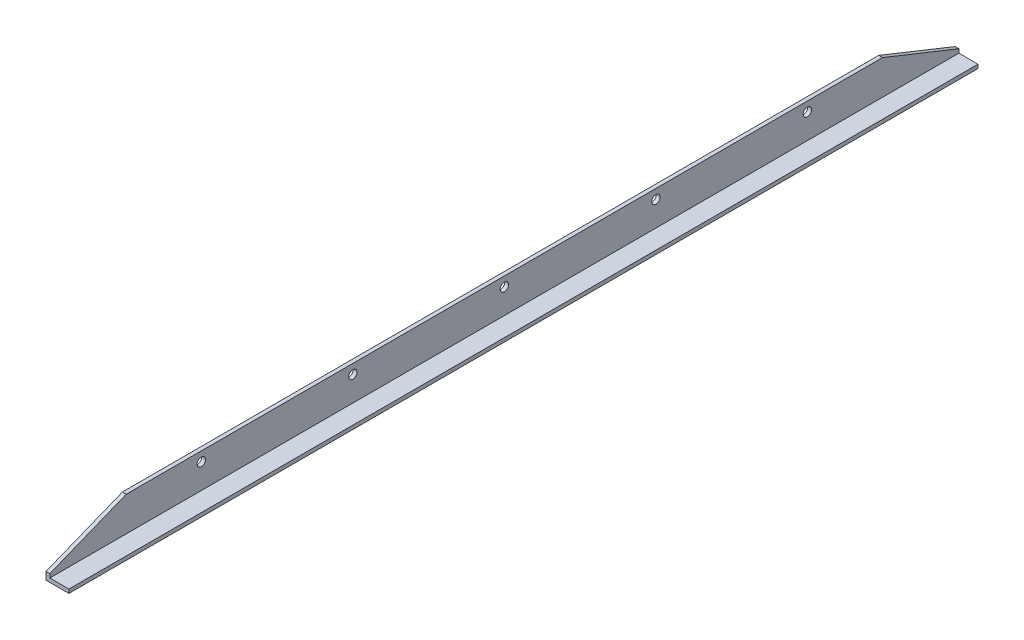
ISO-10303-21;
HEADER;
FILE_DESCRIPTION(('STEP AP214'),'2;1');
FILE_NAME('part.step','',(''),(''),'','','');
FILE_SCHEMA(('AUTOMOTIVE_DESIGN { 1 0 10303 214 1 1 1 1 }'));
ENDSEC;
DATA;
#1=APPLICATION_CONTEXT('core data for automotive mechanical design processes');
#2=APPLICATION_PROTOCOL_DEFINITION('international standard','automotive_design',2000,#1);
#3=PRODUCT_CONTEXT('',#1,'mechanical');
#4=PRODUCT('Part','Part','',(#3));
#5=PRODUCT_RELATED_PRODUCT_CATEGORY('part','',(#4));
#6=PRODUCT_DEFINITION_FORMATION('','',#4);
#7=PRODUCT_DEFINITION_CONTEXT('part definition',#1,'design');
#8=PRODUCT_DEFINITION('design','',#6,#7);
#9=PRODUCT_DEFINITION_SHAPE('','',#8);
#10=(LENGTH_UNIT() NAMED_UNIT(*) SI_UNIT(.MILLI.,.METRE.));
#11=(NAMED_UNIT(*) PLANE_ANGLE_UNIT() SI_UNIT($,.RADIAN.));
#12=(NAMED_UNIT(*) SI_UNIT($,.STERADIAN.) SOLID_ANGLE_UNIT());
#13=UNCERTAINTY_MEASURE_WITH_UNIT(LENGTH_MEASURE(1.E-05),#10,'distance_accuracy_value','');
#14=(GEOMETRIC_REPRESENTATION_CONTEXT(3) GLOBAL_UNCERTAINTY_ASSIGNED_CONTEXT((#13)) GLOBAL_UNIT_ASSIGNED_CONTEXT((#10,
#11,#12)) REPRESENTATION_CONTEXT('',''));
#15=CARTESIAN_POINT('',(0.,0.,0.));
#16=DIRECTION('',(0.,0.,1.));
#17=DIRECTION('',(1.,0.,0.));
#18=AXIS2_PLACEMENT_3D('',#15,#16,#17);
#19=CARTESIAN_POINT('',(0.,0.,1511.3));
#20=DIRECTION('',(0.,1.,0.));
#21=DIRECTION('',(0.,0.,1.));
#22=AXIS2_PLACEMENT_3D('',#19,#20,#21);
#23=PLANE('',#22);
#24=DIRECTION('',(1.,0.,0.));
#25=VECTOR('',#24,1.);
#26=CARTESIAN_POINT('',(0.,0.,0.));
#27=LINE('',#26,#25);
#28=CARTESIAN_POINT('',(0.,0.,0.));
#29=VERTEX_POINT('',#28);
#30=CARTESIAN_POINT('',(38.1,0.,0.));
#31=VERTEX_POINT('',#30);
#32=EDGE_CURVE('E164',#29,#31,#27,.T.);
#33=ORIENTED_EDGE('',*,*,#32,.T.);
#34=DIRECTION('',(0.,0.,-1.));
#35=VECTOR('',#34,1.);
#36=CARTESIAN_POINT('',(38.1,0.,1511.3));
#37=LINE('',#36,#35);
#38=CARTESIAN_POINT('',(38.1,0.,1511.3));
#39=VERTEX_POINT('',#38);
#40=EDGE_CURVE('E11',#39,#31,#37,.T.);
#41=ORIENTED_EDGE('',*,*,#40,.F.);
#42=DIRECTION('',(1.,0.,0.));
#43=VECTOR('',#42,1.);
#44=CARTESIAN_POINT('',(0.,0.,1511.3));
#45=LINE('',#44,#43);
#46=CARTESIAN_POINT('',(0.,0.,1511.3));
#47=VERTEX_POINT('',#46);
#48=EDGE_CURVE('E165',#47,#39,#45,.T.);
#49=ORIENTED_EDGE('',*,*,#48,.F.);
#50=DIRECTION('',(0.,0.,-1.));
#51=VECTOR('',#50,1.);
#52=CARTESIAN_POINT('',(0.,0.,1511.3));
#53=LINE('',#52,#51);
#54=EDGE_CURVE('E128',#47,#29,#53,.T.);
#55=ORIENTED_EDGE('',*,*,#54,.T.);
#56=EDGE_LOOP('',(#33,#41,#49,#55));
#57=FACE_BOUND('',#56,.T.);
#58=ADVANCED_FACE('F38',(#57),#23,.F.);
#59=CARTESIAN_POINT('',(38.1,6.35,1511.3));
#60=DIRECTION('',(1.,0.,0.));
#61=DIRECTION('',(0.,0.,-1.));
#62=AXIS2_PLACEMENT_3D('',#59,#60,#61);
#63=PLANE('',#62);
#64=DIRECTION('',(0.,-1.,0.));
#65=VECTOR('',#64,1.);
#66=CARTESIAN_POINT('',(38.1,6.35,0.));
#67=LINE('',#66,#65);
#68=CARTESIAN_POINT('',(38.1,6.35,0.));
#69=VERTEX_POINT('',#68);
#70=EDGE_CURVE('E180',#69,#31,#67,.T.);
#71=ORIENTED_EDGE('',*,*,#70,.F.);
#72=DIRECTION('',(0.,0.,-1.));
#73=VECTOR('',#72,1.);
#74=CARTESIAN_POINT('',(38.1,6.35,1511.3));
#75=LINE('',#74,#73);
#76=CARTESIAN_POINT('',(38.1,6.35,1511.3));
#77=VERTEX_POINT('',#76);
#78=EDGE_CURVE('E47',#77,#69,#75,.T.);
#79=ORIENTED_EDGE('',*,*,#78,.F.);
#80=DIRECTION('',(0.,-1.,0.));
#81=VECTOR('',#80,1.);
#82=CARTESIAN_POINT('',(38.1,6.35,1511.3));
#83=LINE('',#82,#81);
#84=EDGE_CURVE('E167',#77,#39,#83,.T.);
#85=ORIENTED_EDGE('',*,*,#84,.T.);
#86=ORIENTED_EDGE('',*,*,#40,.T.);
#87=EDGE_LOOP('',(#71,#79,#85,#86));
#88=FACE_BOUND('',#87,.T.);
#89=ADVANCED_FACE('F203',(#88),#63,.T.);
#90=CARTESIAN_POINT('',(0.,6.35,1511.3));
#91=DIRECTION('',(0.,1.,0.));
#92=DIRECTION('',(0.,0.,1.));
#93=AXIS2_PLACEMENT_3D('',#90,#91,#92);
#94=PLANE('',#93);
#95=DIRECTION('',(1.,0.,0.));
#96=VECTOR('',#95,1.);
#97=CARTESIAN_POINT('',(0.,6.35,0.));
#98=LINE('',#97,#96);
#99=CARTESIAN_POINT('',(6.35,6.35,0.));
#100=VERTEX_POINT('',#99);
#101=EDGE_CURVE('E183',#100,#69,#98,.T.);
#102=ORIENTED_EDGE('',*,*,#101,.F.);
#103=DIRECTION('',(0.,0.,-1.));
#104=VECTOR('',#103,1.);
#105=CARTESIAN_POINT('',(6.35,6.35,1511.3));
#106=LINE('',#105,#104);
#107=CARTESIAN_POINT('',(6.35,6.35,1511.3));
#108=VERTEX_POINT('',#107);
#109=EDGE_CURVE('E123',#108,#100,#106,.T.);
#110=ORIENTED_EDGE('',*,*,#109,.F.);
#111=DIRECTION('',(1.,0.,0.));
#112=VECTOR('',#111,1.);
#113=CARTESIAN_POINT('',(0.,6.35,1511.3));
#114=LINE('',#113,#112);
#115=EDGE_CURVE('E171',#108,#77,#114,.T.);
#116=ORIENTED_EDGE('',*,*,#115,.T.);
#117=ORIENTED_EDGE('',*,*,#78,.T.);
#118=EDGE_LOOP('',(#102,#110,#116,#117));
#119=FACE_BOUND('',#118,.T.);
#120=ADVANCED_FACE('F210',(#119),#94,.T.);
#121=CARTESIAN_POINT('',(6.35,63.5,1511.3));
#122=DIRECTION('',(1.,0.,0.));
#123=DIRECTION('',(0.,0.,-1.));
#124=AXIS2_PLACEMENT_3D('',#121,#122,#123);
#125=PLANE('',#124);
#126=DIRECTION('',(0.,-0.371390676354104,0.928476690885259));
#127=VECTOR('',#126,1.);
#128=CARTESIAN_POINT('',(6.34999999999999,12.7,1511.3));
#129=LINE('',#128,#127);
#130=CARTESIAN_POINT('',(6.34999999999999,63.5,1384.3));
#131=VERTEX_POINT('',#130);
#132=CARTESIAN_POINT('',(6.34999999999999,12.7,1511.3));
#133=VERTEX_POINT('',#132);
#134=EDGE_CURVE('E102',#131,#133,#129,.T.);
#135=ORIENTED_EDGE('',*,*,#134,.T.);
#136=DIRECTION('',(0.,1.,0.));
#137=VECTOR('',#136,1.);
#138=CARTESIAN_POINT('',(6.35,63.5,1511.3));
#139=LINE('',#138,#137);
#140=EDGE_CURVE('E174',#133,#108,#139,.F.);
#141=ORIENTED_EDGE('',*,*,#140,.T.);
#142=ORIENTED_EDGE('',*,*,#109,.T.);
#143=DIRECTION('',(0.,1.,0.));
#144=VECTOR('',#143,1.);
#145=CARTESIAN_POINT('',(6.35,63.5,0.));
#146=LINE('',#145,#144);
#147=CARTESIAN_POINT('',(6.35,12.7,0.));
#148=VERTEX_POINT('',#147);
#149=EDGE_CURVE('E186',#148,#100,#146,.F.);
#150=ORIENTED_EDGE('',*,*,#149,.F.);
#151=DIRECTION('',(0.,0.371390676354104,0.928476690885259));
#152=VECTOR('',#151,1.);
#153=CARTESIAN_POINT('',(6.34999999999999,63.5,127.));
#154=LINE('',#153,#152);
#155=CARTESIAN_POINT('',(6.34999999999999,63.5,127.));
#156=VERTEX_POINT('',#155);
#157=EDGE_CURVE('E63',#148,#156,#154,.T.);
#158=ORIENTED_EDGE('',*,*,#157,.T.);
#159=DIRECTION('',(0.,0.,-1.));
#160=VECTOR('',#159,1.);
#161=CARTESIAN_POINT('',(6.35,63.5,1511.3));
#162=LINE('',#161,#160);
#163=EDGE_CURVE('E116',#131,#156,#162,.T.);
#164=ORIENTED_EDGE('',*,*,#163,.F.);
#165=EDGE_LOOP('',(#135,#141,#142,#150,#158,#164));
#166=FACE_BOUND('',#165,.T.);
#167=CARTESIAN_POINT('',(6.35,47.6250000000001,1259.41666666667));
#168=DIRECTION('',(1.,0.,0.));
#169=DIRECTION('',(0.,0.,-1.));
#170=AXIS2_PLACEMENT_3D('',#167,#168,#169);
#171=CIRCLE('',#170,6.94563);
#172=CARTESIAN_POINT('',(6.35,47.6250000000001,1252.47103666667));
#173=VERTEX_POINT('',#172);
#174=EDGE_CURVE('E41',#173,#173,#171,.T.);
#175=ORIENTED_EDGE('',*,*,#174,.F.);
#176=EDGE_LOOP('',(#175));
#177=FACE_BOUND('',#176,.T.);
#178=CARTESIAN_POINT('',(6.35,47.6250000000001,1007.53333333333));
#179=DIRECTION('',(1.,0.,0.));
#180=DIRECTION('',(0.,0.,-1.));
#181=AXIS2_PLACEMENT_3D('',#178,#179,#180);
#182=CIRCLE('',#181,6.94563);
#183=CARTESIAN_POINT('',(6.35,47.6250000000001,1000.58770333333));
#184=VERTEX_POINT('',#183);
#185=EDGE_CURVE('E137',#184,#184,#182,.T.);
#186=ORIENTED_EDGE('',*,*,#185,.F.);
#187=EDGE_LOOP('',(#186));
#188=FACE_BOUND('',#187,.T.);
#189=CARTESIAN_POINT('',(6.35,47.6250000000001,755.65));
#190=DIRECTION('',(1.,0.,0.));
#191=DIRECTION('',(0.,0.,-1.));
#192=AXIS2_PLACEMENT_3D('',#189,#190,#191);
#193=CIRCLE('',#192,6.94563);
#194=CARTESIAN_POINT('',(6.35,47.6250000000001,748.70437));
#195=VERTEX_POINT('',#194);
#196=EDGE_CURVE('E144',#195,#195,#193,.T.);
#197=ORIENTED_EDGE('',*,*,#196,.F.);
#198=EDGE_LOOP('',(#197));
#199=FACE_BOUND('',#198,.T.);
#200=CARTESIAN_POINT('',(6.35,47.625,503.766666666667));
#201=DIRECTION('',(1.,0.,0.));
#202=DIRECTION('',(0.,0.,-1.));
#203=AXIS2_PLACEMENT_3D('',#200,#201,#202);
#204=CIRCLE('',#203,6.94563);
#205=CARTESIAN_POINT('',(6.35,47.625,496.821036666667));
#206=VERTEX_POINT('',#205);
#207=EDGE_CURVE('E133',#206,#206,#204,.T.);
#208=ORIENTED_EDGE('',*,*,#207,.F.);
#209=EDGE_LOOP('',(#208));
#210=FACE_BOUND('',#209,.T.);
#211=CARTESIAN_POINT('',(6.35,47.625,251.883333333333));
#212=DIRECTION('',(1.,0.,0.));
#213=DIRECTION('',(0.,0.,-1.));
#214=AXIS2_PLACEMENT_3D('',#211,#212,#213);
#215=CIRCLE('',#214,6.94563);
#216=CARTESIAN_POINT('',(6.35,47.625,244.937703333333));
#217=VERTEX_POINT('',#216);
#218=EDGE_CURVE('E161',#217,#217,#215,.T.);
#219=ORIENTED_EDGE('',*,*,#218,.F.);
#220=EDGE_LOOP('',(#219));
#221=FACE_BOUND('',#220,.T.);
#222=ADVANCED_FACE('F120',(#166,#177,#188,#199,#210,#221),#125,.T.);
#223=CARTESIAN_POINT('',(0.,63.5,1511.3));
#224=DIRECTION('',(0.,1.,0.));
#225=DIRECTION('',(0.,0.,1.));
#226=AXIS2_PLACEMENT_3D('',#223,#224,#225);
#227=PLANE('',#226);
#228=DIRECTION('',(-1.,0.,0.));
#229=VECTOR('',#228,1.);
#230=CARTESIAN_POINT('',(143.133186101216,63.5,1384.3));
#231=LINE('',#230,#229);
#232=CARTESIAN_POINT('',(0.,63.5,1384.3));
#233=VERTEX_POINT('',#232);
#234=EDGE_CURVE('E105',#131,#233,#231,.T.);
#235=ORIENTED_EDGE('',*,*,#234,.F.);
#236=ORIENTED_EDGE('',*,*,#163,.T.);
#237=DIRECTION('',(-1.,0.,0.));
#238=VECTOR('',#237,1.);
#239=CARTESIAN_POINT('',(143.133186101216,63.5,127.));
#240=LINE('',#239,#238);
#241=CARTESIAN_POINT('',(0.,63.5,127.));
#242=VERTEX_POINT('',#241);
#243=EDGE_CURVE('E214',#156,#242,#240,.T.);
#244=ORIENTED_EDGE('',*,*,#243,.T.);
#245=DIRECTION('',(0.,0.,-1.));
#246=VECTOR('',#245,1.);
#247=CARTESIAN_POINT('',(0.,63.5,1511.3));
#248=LINE('',#247,#246);
#249=EDGE_CURVE('E118',#233,#242,#248,.T.);
#250=ORIENTED_EDGE('',*,*,#249,.F.);
#251=EDGE_LOOP('',(#235,#236,#244,#250));
#252=FACE_BOUND('',#251,.T.);
#253=ADVANCED_FACE('F114',(#252),#227,.T.);
#254=CARTESIAN_POINT('',(0.,63.5,1511.3));
#255=DIRECTION('',(1.,0.,0.));
#256=DIRECTION('',(0.,0.,-1.));
#257=AXIS2_PLACEMENT_3D('',#254,#255,#256);
#258=PLANE('',#257);
#259=CARTESIAN_POINT('',(0.,47.6250000000001,1259.41666666667));
#260=DIRECTION('',(-1.,0.,0.));
#261=DIRECTION('',(0.,0.,1.));
#262=AXIS2_PLACEMENT_3D('',#259,#260,#261);
#263=CIRCLE('',#262,6.94563);
#264=CARTESIAN_POINT('',(0.,47.6250000000001,1266.36229666667));
#265=VERTEX_POINT('',#264);
#266=EDGE_CURVE('E151',#265,#265,#263,.T.);
#267=ORIENTED_EDGE('',*,*,#266,.F.);
#268=EDGE_LOOP('',(#267));
#269=FACE_BOUND('',#268,.T.);
#270=CARTESIAN_POINT('',(0.,47.6250000000001,1007.53333333333));
#271=DIRECTION('',(-1.,0.,0.));
#272=DIRECTION('',(0.,0.,1.));
#273=AXIS2_PLACEMENT_3D('',#270,#271,#272);
#274=CIRCLE('',#273,6.94563);
#275=CARTESIAN_POINT('',(0.,47.6250000000001,1014.47896333333));
#276=VERTEX_POINT('',#275);
#277=EDGE_CURVE('E140',#276,#276,#274,.T.);
#278=ORIENTED_EDGE('',*,*,#277,.F.);
#279=EDGE_LOOP('',(#278));
#280=FACE_BOUND('',#279,.T.);
#281=CARTESIAN_POINT('',(0.,47.6250000000001,755.65));
#282=DIRECTION('',(-1.,0.,0.));
#283=DIRECTION('',(0.,0.,1.));
#284=AXIS2_PLACEMENT_3D('',#281,#282,#283);
#285=CIRCLE('',#284,6.94563);
#286=CARTESIAN_POINT('',(0.,47.6250000000001,762.59563));
#287=VERTEX_POINT('',#286);
#288=EDGE_CURVE('E139',#287,#287,#285,.T.);
#289=ORIENTED_EDGE('',*,*,#288,.F.);
#290=EDGE_LOOP('',(#289));
#291=FACE_BOUND('',#290,.T.);
#292=CARTESIAN_POINT('',(0.,47.625,503.766666666667));
#293=DIRECTION('',(-1.,0.,0.));
#294=DIRECTION('',(0.,0.,1.));
#295=AXIS2_PLACEMENT_3D('',#292,#293,#294);
#296=CIRCLE('',#295,6.94563);
#297=CARTESIAN_POINT('',(0.,47.625,510.712296666667));
#298=VERTEX_POINT('',#297);
#299=EDGE_CURVE('E136',#298,#298,#296,.T.);
#300=ORIENTED_EDGE('',*,*,#299,.F.);
#301=EDGE_LOOP('',(#300));
#302=FACE_BOUND('',#301,.T.);
#303=CARTESIAN_POINT('',(0.,47.625,251.883333333333));
#304=DIRECTION('',(-1.,0.,0.));
#305=DIRECTION('',(0.,0.,1.));
#306=AXIS2_PLACEMENT_3D('',#303,#304,#305);
#307=CIRCLE('',#306,6.94563);
#308=CARTESIAN_POINT('',(0.,47.625,258.828963333333));
#309=VERTEX_POINT('',#308);
#310=EDGE_CURVE('E135',#309,#309,#307,.T.);
#311=ORIENTED_EDGE('',*,*,#310,.F.);
#312=EDGE_LOOP('',(#311));
#313=FACE_BOUND('',#312,.T.);
#314=DIRECTION('',(0.,-1.,0.));
#315=VECTOR('',#314,1.);
#316=CARTESIAN_POINT('',(0.,63.5,1511.3));
#317=LINE('',#316,#315);
#318=CARTESIAN_POINT('',(0.,12.7,1511.3));
#319=VERTEX_POINT('',#318);
#320=EDGE_CURVE('E176',#319,#47,#317,.T.);
#321=ORIENTED_EDGE('',*,*,#320,.F.);
#322=DIRECTION('',(0.,-0.371390676354104,0.928476690885259));
#323=VECTOR('',#322,1.);
#324=CARTESIAN_POINT('',(0.,12.7,1511.3));
#325=LINE('',#324,#323);
#326=EDGE_CURVE('E55',#233,#319,#325,.T.);
#327=ORIENTED_EDGE('',*,*,#326,.F.);
#328=ORIENTED_EDGE('',*,*,#249,.T.);
#329=DIRECTION('',(0.,0.371390676354104,0.928476690885259));
#330=VECTOR('',#329,1.);
#331=CARTESIAN_POINT('',(0.,63.5,127.));
#332=LINE('',#331,#330);
#333=CARTESIAN_POINT('',(0.,12.7,0.));
#334=VERTEX_POINT('',#333);
#335=EDGE_CURVE('E218',#334,#242,#332,.T.);
#336=ORIENTED_EDGE('',*,*,#335,.F.);
#337=DIRECTION('',(0.,-1.,0.));
#338=VECTOR('',#337,1.);
#339=CARTESIAN_POINT('',(0.,63.5,0.));
#340=LINE('',#339,#338);
#341=EDGE_CURVE('E168',#334,#29,#340,.T.);
#342=ORIENTED_EDGE('',*,*,#341,.T.);
#343=ORIENTED_EDGE('',*,*,#54,.F.);
#344=EDGE_LOOP('',(#321,#327,#328,#336,#342,#343));
#345=FACE_BOUND('',#344,.T.);
#346=ADVANCED_FACE('F212',(#269,#280,#291,#302,#313,#345),#258,.F.);
#347=CARTESIAN_POINT('',(0.,0.,1511.3));
#348=DIRECTION('',(0.,0.,-1.));
#349=DIRECTION('',(-1.,0.,0.));
#350=AXIS2_PLACEMENT_3D('',#347,#348,#349);
#351=PLANE('',#350);
#352=ORIENTED_EDGE('',*,*,#140,.F.);
#353=DIRECTION('',(-1.,0.,0.));
#354=VECTOR('',#353,1.);
#355=CARTESIAN_POINT('',(143.133186101216,12.7,1511.3));
#356=LINE('',#355,#354);
#357=EDGE_CURVE('E106',#133,#319,#356,.T.);
#358=ORIENTED_EDGE('',*,*,#357,.T.);
#359=ORIENTED_EDGE('',*,*,#320,.T.);
#360=ORIENTED_EDGE('',*,*,#48,.T.);
#361=ORIENTED_EDGE('',*,*,#84,.F.);
#362=ORIENTED_EDGE('',*,*,#115,.F.);
#363=EDGE_LOOP('',(#352,#358,#359,#360,#361,#362));
#364=FACE_BOUND('',#363,.T.);
#365=ADVANCED_FACE('F207',(#364),#351,.F.);
#366=CARTESIAN_POINT('',(0.,0.,0.));
#367=DIRECTION('',(0.,0.,-1.));
#368=DIRECTION('',(-1.,0.,0.));
#369=AXIS2_PLACEMENT_3D('',#366,#367,#368);
#370=PLANE('',#369);
#371=DIRECTION('',(-1.,0.,0.));
#372=VECTOR('',#371,1.);
#373=CARTESIAN_POINT('',(143.133186101216,12.7,0.));
#374=LINE('',#373,#372);
#375=EDGE_CURVE('E220',#148,#334,#374,.T.);
#376=ORIENTED_EDGE('',*,*,#375,.F.);
#377=ORIENTED_EDGE('',*,*,#149,.T.);
#378=ORIENTED_EDGE('',*,*,#101,.T.);
#379=ORIENTED_EDGE('',*,*,#70,.T.);
#380=ORIENTED_EDGE('',*,*,#32,.F.);
#381=ORIENTED_EDGE('',*,*,#341,.F.);
#382=EDGE_LOOP('',(#376,#377,#378,#379,#380,#381));
#383=FACE_BOUND('',#382,.T.);
#384=ADVANCED_FACE('F199',(#383),#370,.T.);
#385=CARTESIAN_POINT('',(0.,47.625,251.883333333333));
#386=DIRECTION('',(-1.,0.,0.));
#387=DIRECTION('',(0.,0.,1.));
#388=AXIS2_PLACEMENT_3D('',#385,#386,#387);
#389=CYLINDRICAL_SURFACE('',#388,6.94563);
#390=ORIENTED_EDGE('',*,*,#218,.T.);
#391=EDGE_LOOP('',(#390));
#392=FACE_BOUND('',#391,.T.);
#393=ORIENTED_EDGE('',*,*,#310,.T.);
#394=EDGE_LOOP('',(#393));
#395=FACE_BOUND('',#394,.T.);
#396=ADVANCED_FACE('F251',(#392,#395),#389,.F.);
#397=CARTESIAN_POINT('',(0.,47.625,503.766666666667));
#398=DIRECTION('',(-1.,0.,0.));
#399=DIRECTION('',(0.,0.,1.));
#400=AXIS2_PLACEMENT_3D('',#397,#398,#399);
#401=CYLINDRICAL_SURFACE('',#400,6.94563);
#402=ORIENTED_EDGE('',*,*,#207,.T.);
#403=EDGE_LOOP('',(#402));
#404=FACE_BOUND('',#403,.T.);
#405=ORIENTED_EDGE('',*,*,#299,.T.);
#406=EDGE_LOOP('',(#405));
#407=FACE_BOUND('',#406,.T.);
#408=ADVANCED_FACE('F256',(#404,#407),#401,.F.);
#409=CARTESIAN_POINT('',(0.,47.6250000000001,755.65));
#410=DIRECTION('',(-1.,0.,0.));
#411=DIRECTION('',(0.,0.,1.));
#412=AXIS2_PLACEMENT_3D('',#409,#410,#411);
#413=CYLINDRICAL_SURFACE('',#412,6.94563);
#414=ORIENTED_EDGE('',*,*,#196,.T.);
#415=EDGE_LOOP('',(#414));
#416=FACE_BOUND('',#415,.T.);
#417=ORIENTED_EDGE('',*,*,#288,.T.);
#418=EDGE_LOOP('',(#417));
#419=FACE_BOUND('',#418,.T.);
#420=ADVANCED_FACE('F260',(#416,#419),#413,.F.);
#421=CARTESIAN_POINT('',(0.,47.6250000000001,1007.53333333333));
#422=DIRECTION('',(-1.,0.,0.));
#423=DIRECTION('',(0.,0.,1.));
#424=AXIS2_PLACEMENT_3D('',#421,#422,#423);
#425=CYLINDRICAL_SURFACE('',#424,6.94563);
#426=ORIENTED_EDGE('',*,*,#185,.T.);
#427=EDGE_LOOP('',(#426));
#428=FACE_BOUND('',#427,.T.);
#429=ORIENTED_EDGE('',*,*,#277,.T.);
#430=EDGE_LOOP('',(#429));
#431=FACE_BOUND('',#430,.T.);
#432=ADVANCED_FACE('F230',(#428,#431),#425,.F.);
#433=CARTESIAN_POINT('',(0.,47.6250000000001,1259.41666666667));
#434=DIRECTION('',(-1.,0.,0.));
#435=DIRECTION('',(0.,0.,1.));
#436=AXIS2_PLACEMENT_3D('',#433,#434,#435);
#437=CYLINDRICAL_SURFACE('',#436,6.94563);
#438=ORIENTED_EDGE('',*,*,#174,.T.);
#439=EDGE_LOOP('',(#438));
#440=FACE_BOUND('',#439,.T.);
#441=ORIENTED_EDGE('',*,*,#266,.T.);
#442=EDGE_LOOP('',(#441));
#443=FACE_BOUND('',#442,.T.);
#444=ADVANCED_FACE('F223',(#440,#443),#437,.F.);
#445=CARTESIAN_POINT('',(143.133186101216,63.5,127.));
#446=DIRECTION('',(0.,-0.928476690885259,0.371390676354104));
#447=DIRECTION('',(0.,-0.371390676354104,-0.928476690885259));
#448=AXIS2_PLACEMENT_3D('',#445,#446,#447);
#449=PLANE('',#448);
#450=ORIENTED_EDGE('',*,*,#375,.T.);
#451=ORIENTED_EDGE('',*,*,#335,.T.);
#452=ORIENTED_EDGE('',*,*,#243,.F.);
#453=ORIENTED_EDGE('',*,*,#157,.F.);
#454=EDGE_LOOP('',(#450,#451,#452,#453));
#455=FACE_BOUND('',#454,.T.);
#456=ADVANCED_FACE('F221',(#455),#449,.F.);
#457=CARTESIAN_POINT('',(143.133186101216,12.7,1511.3));
#458=DIRECTION('',(0.,-0.928476690885259,-0.371390676354104));
#459=DIRECTION('',(0.,0.371390676354104,-0.928476690885259));
#460=AXIS2_PLACEMENT_3D('',#457,#458,#459);
#461=PLANE('',#460);
#462=ORIENTED_EDGE('',*,*,#234,.T.);
#463=ORIENTED_EDGE('',*,*,#326,.T.);
#464=ORIENTED_EDGE('',*,*,#357,.F.);
#465=ORIENTED_EDGE('',*,*,#134,.F.);
#466=EDGE_LOOP('',(#462,#463,#464,#465));
#467=FACE_BOUND('',#466,.T.);
#468=ADVANCED_FACE('F104',(#467),#461,.F.);
#469=CLOSED_SHELL('',(#58,#89,#120,#222,#253,#346,#365,#384,#396,#408,#420,#432,#444,#456,#468));
#470=MANIFOLD_SOLID_BREP('B2',#469);
#471=ADVANCED_BREP_SHAPE_REPRESENTATION('',(#18,#470),#14);
#472=SHAPE_DEFINITION_REPRESENTATION(#9,#471);
ENDSEC;
END-ISO-10303-21;
